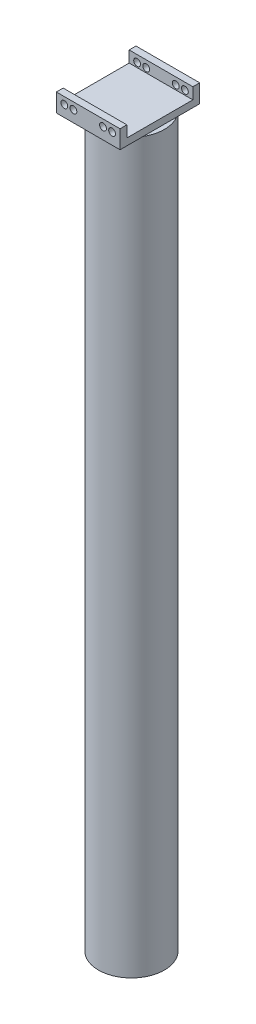
ISO-10303-21;
HEADER;
FILE_DESCRIPTION(('STEP AP214'),'2;1');
FILE_NAME('part.step','',(''),(''),'','','');
FILE_SCHEMA(('AUTOMOTIVE_DESIGN { 1 0 10303 214 1 1 1 1 }'));
ENDSEC;
DATA;
#1=APPLICATION_CONTEXT('core data for automotive mechanical design processes');
#2=APPLICATION_PROTOCOL_DEFINITION('international standard','automotive_design',2000,#1);
#3=PRODUCT_CONTEXT('',#1,'mechanical');
#4=PRODUCT('Part','Part','',(#3));
#5=PRODUCT_RELATED_PRODUCT_CATEGORY('part','',(#4));
#6=PRODUCT_DEFINITION_FORMATION('','',#4);
#7=PRODUCT_DEFINITION_CONTEXT('part definition',#1,'design');
#8=PRODUCT_DEFINITION('design','',#6,#7);
#9=PRODUCT_DEFINITION_SHAPE('','',#8);
#10=(LENGTH_UNIT() NAMED_UNIT(*) SI_UNIT(.MILLI.,.METRE.));
#11=(NAMED_UNIT(*) PLANE_ANGLE_UNIT() SI_UNIT($,.RADIAN.));
#12=(NAMED_UNIT(*) SI_UNIT($,.STERADIAN.) SOLID_ANGLE_UNIT());
#13=UNCERTAINTY_MEASURE_WITH_UNIT(LENGTH_MEASURE(1.E-05),#10,'distance_accuracy_value','');
#14=(GEOMETRIC_REPRESENTATION_CONTEXT(3) GLOBAL_UNCERTAINTY_ASSIGNED_CONTEXT((#13)) GLOBAL_UNIT_ASSIGNED_CONTEXT((#10,
#11,#12)) REPRESENTATION_CONTEXT('',''));
#15=CARTESIAN_POINT('',(0.,0.,0.));
#16=DIRECTION('',(0.,0.,1.));
#17=DIRECTION('',(1.,0.,0.));
#18=AXIS2_PLACEMENT_3D('',#15,#16,#17);
#19=CARTESIAN_POINT('',(-15.5,328.,17.5));
#20=DIRECTION('',(0.,-1.,0.));
#21=DIRECTION('',(0.,0.,-1.));
#22=AXIS2_PLACEMENT_3D('',#19,#20,#21);
#23=PLANE('',#22);
#24=DIRECTION('',(0.,0.,-1.));
#25=VECTOR('',#24,1.);
#26=CARTESIAN_POINT('',(12.5,328.,17.5));
#27=LINE('',#26,#25);
#28=CARTESIAN_POINT('',(12.5,328.,17.5));
#29=VERTEX_POINT('',#28);
#30=CARTESIAN_POINT('',(12.5,328.,14.5));
#31=VERTEX_POINT('',#30);
#32=EDGE_CURVE('E168',#29,#31,#27,.T.);
#33=ORIENTED_EDGE('',*,*,#32,.T.);
#34=DIRECTION('',(1.,0.,0.));
#35=VECTOR('',#34,1.);
#36=CARTESIAN_POINT('',(-44.9278779391243,328.,14.5));
#37=LINE('',#36,#35);
#38=CARTESIAN_POINT('',(-15.5,328.,14.5));
#39=VERTEX_POINT('',#38);
#40=EDGE_CURVE('E122',#39,#31,#37,.T.);
#41=ORIENTED_EDGE('',*,*,#40,.F.);
#42=DIRECTION('',(0.,0.,-1.));
#43=VECTOR('',#42,1.);
#44=CARTESIAN_POINT('',(-15.5,328.,17.5));
#45=LINE('',#44,#43);
#46=CARTESIAN_POINT('',(-15.5,328.,17.5));
#47=VERTEX_POINT('',#46);
#48=EDGE_CURVE('E164',#47,#39,#45,.T.);
#49=ORIENTED_EDGE('',*,*,#48,.F.);
#50=DIRECTION('',(-1.,0.,0.));
#51=VECTOR('',#50,1.);
#52=CARTESIAN_POINT('',(-15.5,328.,17.5));
#53=LINE('',#52,#51);
#54=EDGE_CURVE('E151',#29,#47,#53,.T.);
#55=ORIENTED_EDGE('',*,*,#54,.F.);
#56=EDGE_LOOP('',(#33,#41,#49,#55));
#57=FACE_BOUND('',#56,.T.);
#58=ADVANCED_FACE('F35',(#57),#23,.F.);
#59=CARTESIAN_POINT('',(0.,320.,0.));
#60=DIRECTION('',(0.,-1.,0.));
#61=DIRECTION('',(0.,0.,-1.));
#62=AXIS2_PLACEMENT_3D('',#59,#60,#61);
#63=CYLINDRICAL_SURFACE('',#62,14.5);
#64=CARTESIAN_POINT('',(0.,320.,0.));
#65=DIRECTION('',(0.,1.,0.));
#66=DIRECTION('',(0.,0.,1.));
#67=AXIS2_PLACEMENT_3D('',#64,#65,#66);
#68=CIRCLE('',#67,14.5);
#69=CARTESIAN_POINT('',(12.5,320.,7.34846922834953));
#70=VERTEX_POINT('',#69);
#71=CARTESIAN_POINT('',(12.5,320.,-7.34846922834953));
#72=VERTEX_POINT('',#71);
#73=EDGE_CURVE('E44',#70,#72,#68,.T.);
#74=ORIENTED_EDGE('',*,*,#73,.F.);
#75=EDGE_CURVE('E182',#72,#70,#68,.T.);
#76=ORIENTED_EDGE('',*,*,#75,.F.);
#77=EDGE_LOOP('',(#74,#76));
#78=FACE_BOUND('',#77,.T.);
#79=CARTESIAN_POINT('',(0.,0.,0.));
#80=DIRECTION('',(0.,1.,0.));
#81=DIRECTION('',(0.,0.,1.));
#82=AXIS2_PLACEMENT_3D('',#79,#80,#81);
#83=CIRCLE('',#82,14.5);
#84=CARTESIAN_POINT('',(0.,0.,14.5));
#85=VERTEX_POINT('',#84);
#86=EDGE_CURVE('E180',#85,#85,#83,.T.);
#87=ORIENTED_EDGE('',*,*,#86,.T.);
#88=EDGE_LOOP('',(#87));
#89=FACE_BOUND('',#88,.T.);
#90=ADVANCED_FACE('F37',(#78,#89),#63,.T.);
#91=CARTESIAN_POINT('',(0.,320.,0.));
#92=DIRECTION('',(0.,1.,0.));
#93=DIRECTION('',(0.,0.,1.));
#94=AXIS2_PLACEMENT_3D('',#91,#92,#93);
#95=PLANE('',#94);
#96=DIRECTION('',(0.,0.,-1.));
#97=VECTOR('',#96,1.);
#98=CARTESIAN_POINT('',(12.5,320.,17.5));
#99=LINE('',#98,#97);
#100=EDGE_CURVE('E11',#70,#72,#99,.T.);
#101=ORIENTED_EDGE('',*,*,#100,.F.);
#102=ORIENTED_EDGE('',*,*,#73,.T.);
#103=EDGE_LOOP('',(#101,#102));
#104=FACE_BOUND('',#103,.T.);
#105=ADVANCED_FACE('F227',(#104),#95,.T.);
#106=CARTESIAN_POINT('',(0.,0.,0.));
#107=DIRECTION('',(0.,1.,0.));
#108=DIRECTION('',(0.,0.,1.));
#109=AXIS2_PLACEMENT_3D('',#106,#107,#108);
#110=PLANE('',#109);
#111=CARTESIAN_POINT('',(0.,0.,0.));
#112=DIRECTION('',(0.,1.,0.));
#113=DIRECTION('',(0.,0.,1.));
#114=AXIS2_PLACEMENT_3D('',#111,#112,#113);
#115=CIRCLE('',#114,11.5);
#116=CARTESIAN_POINT('',(0.,0.,11.5));
#117=VERTEX_POINT('',#116);
#118=EDGE_CURVE('E177',#117,#117,#115,.T.);
#119=ORIENTED_EDGE('',*,*,#118,.T.);
#120=EDGE_LOOP('',(#119));
#121=FACE_BOUND('',#120,.T.);
#122=ORIENTED_EDGE('',*,*,#86,.F.);
#123=EDGE_LOOP('',(#122));
#124=FACE_BOUND('',#123,.T.);
#125=ADVANCED_FACE('F229',(#121,#124),#110,.F.);
#126=CARTESIAN_POINT('',(0.,320.,0.));
#127=DIRECTION('',(0.,-1.,0.));
#128=DIRECTION('',(0.,0.,-1.));
#129=AXIS2_PLACEMENT_3D('',#126,#127,#128);
#130=CYLINDRICAL_SURFACE('',#129,11.5);
#131=CARTESIAN_POINT('',(0.,320.,0.));
#132=DIRECTION('',(0.,1.,0.));
#133=DIRECTION('',(0.,0.,1.));
#134=AXIS2_PLACEMENT_3D('',#131,#132,#133);
#135=CIRCLE('',#134,11.5);
#136=CARTESIAN_POINT('',(0.,320.,11.5));
#137=VERTEX_POINT('',#136);
#138=EDGE_CURVE('E174',#137,#137,#135,.T.);
#139=ORIENTED_EDGE('',*,*,#138,.T.);
#140=EDGE_LOOP('',(#139));
#141=FACE_BOUND('',#140,.T.);
#142=ORIENTED_EDGE('',*,*,#118,.F.);
#143=EDGE_LOOP('',(#142));
#144=FACE_BOUND('',#143,.T.);
#145=ADVANCED_FACE('F235',(#141,#144),#130,.F.);
#146=CARTESIAN_POINT('',(0.,0.,-17.5));
#147=DIRECTION('',(0.,0.,1.));
#148=DIRECTION('',(1.,0.,0.));
#149=AXIS2_PLACEMENT_3D('',#146,#147,#148);
#150=PLANE('',#149);
#151=CARTESIAN_POINT('',(-12.,325.,-17.5));
#152=DIRECTION('',(0.,0.,1.));
#153=DIRECTION('',(1.,0.,0.));
#154=AXIS2_PLACEMENT_3D('',#151,#152,#153);
#155=CIRCLE('',#154,1.5);
#156=CARTESIAN_POINT('',(-10.5,325.,-17.5));
#157=VERTEX_POINT('',#156);
#158=EDGE_CURVE('E285',#157,#157,#155,.F.);
#159=ORIENTED_EDGE('',*,*,#158,.F.);
#160=EDGE_LOOP('',(#159));
#161=FACE_BOUND('',#160,.T.);
#162=CARTESIAN_POINT('',(9.,325.,-17.5));
#163=DIRECTION('',(0.,0.,1.));
#164=DIRECTION('',(1.,0.,0.));
#165=AXIS2_PLACEMENT_3D('',#162,#163,#164);
#166=CIRCLE('',#165,1.5);
#167=CARTESIAN_POINT('',(10.5,325.,-17.5));
#168=VERTEX_POINT('',#167);
#169=EDGE_CURVE('E289',#168,#168,#166,.F.);
#170=ORIENTED_EDGE('',*,*,#169,.F.);
#171=EDGE_LOOP('',(#170));
#172=FACE_BOUND('',#171,.T.);
#173=CARTESIAN_POINT('',(5.,325.,-17.5));
#174=DIRECTION('',(0.,0.,1.));
#175=DIRECTION('',(1.,0.,0.));
#176=AXIS2_PLACEMENT_3D('',#173,#174,#175);
#177=CIRCLE('',#176,1.5);
#178=CARTESIAN_POINT('',(6.5,325.,-17.5));
#179=VERTEX_POINT('',#178);
#180=EDGE_CURVE('E293',#179,#179,#177,.F.);
#181=ORIENTED_EDGE('',*,*,#180,.F.);
#182=EDGE_LOOP('',(#181));
#183=FACE_BOUND('',#182,.T.);
#184=CARTESIAN_POINT('',(-8.,325.,-17.5));
#185=DIRECTION('',(0.,0.,1.));
#186=DIRECTION('',(1.,0.,0.));
#187=AXIS2_PLACEMENT_3D('',#184,#185,#186);
#188=CIRCLE('',#187,1.5);
#189=CARTESIAN_POINT('',(-6.5,325.,-17.5));
#190=VERTEX_POINT('',#189);
#191=EDGE_CURVE('E189',#190,#190,#188,.F.);
#192=ORIENTED_EDGE('',*,*,#191,.F.);
#193=EDGE_LOOP('',(#192));
#194=FACE_BOUND('',#193,.T.);
#195=DIRECTION('',(0.,-1.,0.));
#196=VECTOR('',#195,1.);
#197=CARTESIAN_POINT('',(-15.5,328.,-17.5));
#198=LINE('',#197,#196);
#199=CARTESIAN_POINT('',(-15.5,328.,-17.5));
#200=VERTEX_POINT('',#199);
#201=CARTESIAN_POINT('',(-15.5,320.,-17.5));
#202=VERTEX_POINT('',#201);
#203=EDGE_CURVE('E141',#200,#202,#198,.T.);
#204=ORIENTED_EDGE('',*,*,#203,.F.);
#205=DIRECTION('',(-1.,0.,0.));
#206=VECTOR('',#205,1.);
#207=CARTESIAN_POINT('',(-15.5,328.,-17.5));
#208=LINE('',#207,#206);
#209=CARTESIAN_POINT('',(12.5,328.,-17.5));
#210=VERTEX_POINT('',#209);
#211=EDGE_CURVE('E147',#210,#200,#208,.T.);
#212=ORIENTED_EDGE('',*,*,#211,.F.);
#213=DIRECTION('',(0.,1.,0.));
#214=VECTOR('',#213,1.);
#215=CARTESIAN_POINT('',(12.5,328.,-17.5));
#216=LINE('',#215,#214);
#217=CARTESIAN_POINT('',(12.5,320.,-17.5));
#218=VERTEX_POINT('',#217);
#219=EDGE_CURVE('E159',#218,#210,#216,.T.);
#220=ORIENTED_EDGE('',*,*,#219,.F.);
#221=DIRECTION('',(1.,0.,0.));
#222=VECTOR('',#221,1.);
#223=CARTESIAN_POINT('',(-15.5,320.,-17.5));
#224=LINE('',#223,#222);
#225=EDGE_CURVE('E156',#202,#218,#224,.T.);
#226=ORIENTED_EDGE('',*,*,#225,.F.);
#227=EDGE_LOOP('',(#204,#212,#220,#226));
#228=FACE_BOUND('',#227,.T.);
#229=ADVANCED_FACE('F251',(#161,#172,#183,#194,#228),#150,.F.);
#230=CARTESIAN_POINT('',(0.,0.,17.5));
#231=DIRECTION('',(0.,0.,1.));
#232=DIRECTION('',(1.,0.,0.));
#233=AXIS2_PLACEMENT_3D('',#230,#231,#232);
#234=PLANE('',#233);
#235=CARTESIAN_POINT('',(-12.,325.,17.5));
#236=DIRECTION('',(0.,0.,1.));
#237=DIRECTION('',(1.,0.,0.));
#238=AXIS2_PLACEMENT_3D('',#235,#236,#237);
#239=CIRCLE('',#238,1.5);
#240=CARTESIAN_POINT('',(-10.5,325.,17.5));
#241=VERTEX_POINT('',#240);
#242=EDGE_CURVE('E305',#241,#241,#239,.T.);
#243=ORIENTED_EDGE('',*,*,#242,.F.);
#244=EDGE_LOOP('',(#243));
#245=FACE_BOUND('',#244,.T.);
#246=CARTESIAN_POINT('',(9.,325.,17.5));
#247=DIRECTION('',(0.,0.,1.));
#248=DIRECTION('',(1.,0.,0.));
#249=AXIS2_PLACEMENT_3D('',#246,#247,#248);
#250=CIRCLE('',#249,1.5);
#251=CARTESIAN_POINT('',(10.5,325.,17.5));
#252=VERTEX_POINT('',#251);
#253=EDGE_CURVE('E304',#252,#252,#250,.T.);
#254=ORIENTED_EDGE('',*,*,#253,.F.);
#255=EDGE_LOOP('',(#254));
#256=FACE_BOUND('',#255,.T.);
#257=CARTESIAN_POINT('',(5.,325.,17.5));
#258=DIRECTION('',(0.,0.,1.));
#259=DIRECTION('',(1.,0.,0.));
#260=AXIS2_PLACEMENT_3D('',#257,#258,#259);
#261=CIRCLE('',#260,1.5);
#262=CARTESIAN_POINT('',(6.5,325.,17.5));
#263=VERTEX_POINT('',#262);
#264=EDGE_CURVE('E309',#263,#263,#261,.T.);
#265=ORIENTED_EDGE('',*,*,#264,.F.);
#266=EDGE_LOOP('',(#265));
#267=FACE_BOUND('',#266,.T.);
#268=CARTESIAN_POINT('',(-8.,325.,17.5));
#269=DIRECTION('',(0.,0.,1.));
#270=DIRECTION('',(1.,0.,0.));
#271=AXIS2_PLACEMENT_3D('',#268,#269,#270);
#272=CIRCLE('',#271,1.5);
#273=CARTESIAN_POINT('',(-6.5,325.,17.5));
#274=VERTEX_POINT('',#273);
#275=EDGE_CURVE('E299',#274,#274,#272,.T.);
#276=ORIENTED_EDGE('',*,*,#275,.F.);
#277=EDGE_LOOP('',(#276));
#278=FACE_BOUND('',#277,.T.);
#279=DIRECTION('',(0.,-1.,0.));
#280=VECTOR('',#279,1.);
#281=CARTESIAN_POINT('',(-15.5,328.,17.5));
#282=LINE('',#281,#280);
#283=CARTESIAN_POINT('',(-15.5,320.,17.5));
#284=VERTEX_POINT('',#283);
#285=EDGE_CURVE('E143',#47,#284,#282,.T.);
#286=ORIENTED_EDGE('',*,*,#285,.T.);
#287=DIRECTION('',(1.,0.,0.));
#288=VECTOR('',#287,1.);
#289=CARTESIAN_POINT('',(-15.5,320.,17.5));
#290=LINE('',#289,#288);
#291=CARTESIAN_POINT('',(12.5,320.,17.5));
#292=VERTEX_POINT('',#291);
#293=EDGE_CURVE('E146',#284,#292,#290,.T.);
#294=ORIENTED_EDGE('',*,*,#293,.T.);
#295=DIRECTION('',(0.,1.,0.));
#296=VECTOR('',#295,1.);
#297=CARTESIAN_POINT('',(12.5,328.,17.5));
#298=LINE('',#297,#296);
#299=EDGE_CURVE('E149',#292,#29,#298,.T.);
#300=ORIENTED_EDGE('',*,*,#299,.T.);
#301=ORIENTED_EDGE('',*,*,#54,.T.);
#302=EDGE_LOOP('',(#286,#294,#300,#301));
#303=FACE_BOUND('',#302,.T.);
#304=ADVANCED_FACE('F217',(#245,#256,#267,#278,#303),#234,.T.);
#305=CARTESIAN_POINT('',(-15.5,328.,-14.5));
#306=VERTEX_POINT('',#305);
#307=EDGE_CURVE('E153',#306,#200,#45,.T.);
#308=ORIENTED_EDGE('',*,*,#307,.F.);
#309=DIRECTION('',(1.,0.,0.));
#310=VECTOR('',#309,1.);
#311=CARTESIAN_POINT('',(-44.9278779391243,328.,-14.5));
#312=LINE('',#311,#310);
#313=CARTESIAN_POINT('',(12.5,328.,-14.5));
#314=VERTEX_POINT('',#313);
#315=EDGE_CURVE('E136',#306,#314,#312,.T.);
#316=ORIENTED_EDGE('',*,*,#315,.T.);
#317=EDGE_CURVE('E167',#314,#210,#27,.T.);
#318=ORIENTED_EDGE('',*,*,#317,.T.);
#319=ORIENTED_EDGE('',*,*,#211,.T.);
#320=EDGE_LOOP('',(#308,#316,#318,#319));
#321=FACE_BOUND('',#320,.T.);
#322=ADVANCED_FACE('F240',(#321),#23,.F.);
#323=CARTESIAN_POINT('',(12.5,328.,17.5));
#324=DIRECTION('',(-1.,0.,0.));
#325=DIRECTION('',(0.,-1.,0.));
#326=AXIS2_PLACEMENT_3D('',#323,#324,#325);
#327=PLANE('',#326);
#328=DIRECTION('',(0.,0.,-1.));
#329=VECTOR('',#328,1.);
#330=CARTESIAN_POINT('',(12.5,323.,14.5));
#331=LINE('',#330,#329);
#332=CARTESIAN_POINT('',(12.5,323.,14.5));
#333=VERTEX_POINT('',#332);
#334=CARTESIAN_POINT('',(12.5,323.,-14.5));
#335=VERTEX_POINT('',#334);
#336=EDGE_CURVE('E110',#333,#335,#331,.T.);
#337=ORIENTED_EDGE('',*,*,#336,.F.);
#338=DIRECTION('',(0.,-1.,0.));
#339=VECTOR('',#338,1.);
#340=CARTESIAN_POINT('',(12.5,328.,14.5));
#341=LINE('',#340,#339);
#342=EDGE_CURVE('E119',#31,#333,#341,.T.);
#343=ORIENTED_EDGE('',*,*,#342,.F.);
#344=ORIENTED_EDGE('',*,*,#32,.F.);
#345=ORIENTED_EDGE('',*,*,#299,.F.);
#346=EDGE_CURVE('E46',#292,#70,#99,.T.);
#347=ORIENTED_EDGE('',*,*,#346,.T.);
#348=ORIENTED_EDGE('',*,*,#100,.T.);
#349=EDGE_CURVE('E47',#72,#218,#99,.T.);
#350=ORIENTED_EDGE('',*,*,#349,.T.);
#351=ORIENTED_EDGE('',*,*,#219,.T.);
#352=ORIENTED_EDGE('',*,*,#317,.F.);
#353=DIRECTION('',(0.,1.,0.));
#354=VECTOR('',#353,1.);
#355=CARTESIAN_POINT('',(12.5,328.,-14.5));
#356=LINE('',#355,#354);
#357=EDGE_CURVE('E116',#335,#314,#356,.T.);
#358=ORIENTED_EDGE('',*,*,#357,.F.);
#359=EDGE_LOOP('',(#337,#343,#344,#345,#347,#348,#350,#351,#352,#358));
#360=FACE_BOUND('',#359,.T.);
#361=ADVANCED_FACE('F128',(#360),#327,.F.);
#362=CARTESIAN_POINT('',(-15.5,328.,17.5));
#363=DIRECTION('',(1.,0.,0.));
#364=DIRECTION('',(0.,0.,-1.));
#365=AXIS2_PLACEMENT_3D('',#362,#363,#364);
#366=PLANE('',#365);
#367=ORIENTED_EDGE('',*,*,#48,.T.);
#368=DIRECTION('',(0.,1.,0.));
#369=VECTOR('',#368,1.);
#370=CARTESIAN_POINT('',(-15.5,328.,14.5));
#371=LINE('',#370,#369);
#372=CARTESIAN_POINT('',(-15.5,323.,14.5));
#373=VERTEX_POINT('',#372);
#374=EDGE_CURVE('E142',#373,#39,#371,.T.);
#375=ORIENTED_EDGE('',*,*,#374,.F.);
#376=DIRECTION('',(0.,0.,1.));
#377=VECTOR('',#376,1.);
#378=CARTESIAN_POINT('',(-15.5,323.,14.5));
#379=LINE('',#378,#377);
#380=CARTESIAN_POINT('',(-15.5,323.,-14.5));
#381=VERTEX_POINT('',#380);
#382=EDGE_CURVE('E113',#381,#373,#379,.T.);
#383=ORIENTED_EDGE('',*,*,#382,.F.);
#384=DIRECTION('',(0.,-1.,0.));
#385=VECTOR('',#384,1.);
#386=CARTESIAN_POINT('',(-15.5,328.,-14.5));
#387=LINE('',#386,#385);
#388=EDGE_CURVE('E135',#306,#381,#387,.T.);
#389=ORIENTED_EDGE('',*,*,#388,.F.);
#390=ORIENTED_EDGE('',*,*,#307,.T.);
#391=ORIENTED_EDGE('',*,*,#203,.T.);
#392=DIRECTION('',(0.,0.,-1.));
#393=VECTOR('',#392,1.);
#394=CARTESIAN_POINT('',(-15.5,320.,17.5));
#395=LINE('',#394,#393);
#396=EDGE_CURVE('E171',#284,#202,#395,.T.);
#397=ORIENTED_EDGE('',*,*,#396,.F.);
#398=ORIENTED_EDGE('',*,*,#285,.F.);
#399=EDGE_LOOP('',(#367,#375,#383,#389,#390,#391,#397,#398));
#400=FACE_BOUND('',#399,.T.);
#401=ADVANCED_FACE('F214',(#400),#366,.F.);
#402=CARTESIAN_POINT('',(-15.5,320.,17.5));
#403=DIRECTION('',(0.,1.,0.));
#404=DIRECTION('',(0.,0.,1.));
#405=AXIS2_PLACEMENT_3D('',#402,#403,#404);
#406=PLANE('',#405);
#407=ORIENTED_EDGE('',*,*,#349,.F.);
#408=ORIENTED_EDGE('',*,*,#75,.T.);
#409=ORIENTED_EDGE('',*,*,#346,.F.);
#410=ORIENTED_EDGE('',*,*,#293,.F.);
#411=ORIENTED_EDGE('',*,*,#396,.T.);
#412=ORIENTED_EDGE('',*,*,#225,.T.);
#413=EDGE_LOOP('',(#407,#408,#409,#410,#411,#412));
#414=FACE_BOUND('',#413,.T.);
#415=ADVANCED_FACE('F223',(#414),#406,.F.);
#416=ORIENTED_EDGE('',*,*,#138,.F.);
#417=EDGE_LOOP('',(#416));
#418=FACE_BOUND('',#417,.T.);
#419=ADVANCED_FACE('F269',(#418),#406,.F.);
#420=CARTESIAN_POINT('',(-44.9278779391243,328.,14.5));
#421=DIRECTION('',(0.,0.,1.));
#422=DIRECTION('',(1.,0.,0.));
#423=AXIS2_PLACEMENT_3D('',#420,#421,#422);
#424=PLANE('',#423);
#425=CARTESIAN_POINT('',(-12.,325.,14.5));
#426=DIRECTION('',(0.,0.,1.));
#427=DIRECTION('',(1.,0.,0.));
#428=AXIS2_PLACEMENT_3D('',#425,#426,#427);
#429=CIRCLE('',#428,1.5);
#430=CARTESIAN_POINT('',(-10.5,325.,14.5));
#431=VERTEX_POINT('',#430);
#432=EDGE_CURVE('E126',#431,#431,#429,.T.);
#433=ORIENTED_EDGE('',*,*,#432,.T.);
#434=EDGE_LOOP('',(#433));
#435=FACE_BOUND('',#434,.T.);
#436=CARTESIAN_POINT('',(9.,325.,14.5));
#437=DIRECTION('',(0.,0.,1.));
#438=DIRECTION('',(1.,0.,0.));
#439=AXIS2_PLACEMENT_3D('',#436,#437,#438);
#440=CIRCLE('',#439,1.5);
#441=CARTESIAN_POINT('',(10.5,325.,14.5));
#442=VERTEX_POINT('',#441);
#443=EDGE_CURVE('E195',#442,#442,#440,.T.);
#444=ORIENTED_EDGE('',*,*,#443,.T.);
#445=EDGE_LOOP('',(#444));
#446=FACE_BOUND('',#445,.T.);
#447=CARTESIAN_POINT('',(5.,325.,14.5));
#448=DIRECTION('',(0.,0.,1.));
#449=DIRECTION('',(1.,0.,0.));
#450=AXIS2_PLACEMENT_3D('',#447,#448,#449);
#451=CIRCLE('',#450,1.5);
#452=CARTESIAN_POINT('',(6.5,325.,14.5));
#453=VERTEX_POINT('',#452);
#454=EDGE_CURVE('E192',#453,#453,#451,.T.);
#455=ORIENTED_EDGE('',*,*,#454,.T.);
#456=EDGE_LOOP('',(#455));
#457=FACE_BOUND('',#456,.T.);
#458=CARTESIAN_POINT('',(-8.,325.,14.5));
#459=DIRECTION('',(0.,0.,1.));
#460=DIRECTION('',(1.,0.,0.));
#461=AXIS2_PLACEMENT_3D('',#458,#459,#460);
#462=CIRCLE('',#461,1.5);
#463=CARTESIAN_POINT('',(-6.5,325.,14.5));
#464=VERTEX_POINT('',#463);
#465=EDGE_CURVE('E188',#464,#464,#462,.T.);
#466=ORIENTED_EDGE('',*,*,#465,.T.);
#467=EDGE_LOOP('',(#466));
#468=FACE_BOUND('',#467,.T.);
#469=ORIENTED_EDGE('',*,*,#374,.T.);
#470=ORIENTED_EDGE('',*,*,#40,.T.);
#471=ORIENTED_EDGE('',*,*,#342,.T.);
#472=DIRECTION('',(1.,0.,0.));
#473=VECTOR('',#472,1.);
#474=CARTESIAN_POINT('',(-44.9278779391243,323.,14.5));
#475=LINE('',#474,#473);
#476=EDGE_CURVE('E106',#373,#333,#475,.T.);
#477=ORIENTED_EDGE('',*,*,#476,.F.);
#478=EDGE_LOOP('',(#469,#470,#471,#477));
#479=FACE_BOUND('',#478,.T.);
#480=ADVANCED_FACE('F120',(#435,#446,#457,#468,#479),#424,.F.);
#481=CARTESIAN_POINT('',(-44.9278779391243,328.,-14.5));
#482=DIRECTION('',(0.,0.,-1.));
#483=DIRECTION('',(-1.,0.,0.));
#484=AXIS2_PLACEMENT_3D('',#481,#482,#483);
#485=PLANE('',#484);
#486=CARTESIAN_POINT('',(-12.,325.,-14.5));
#487=DIRECTION('',(0.,0.,-1.));
#488=DIRECTION('',(-1.,0.,0.));
#489=AXIS2_PLACEMENT_3D('',#486,#487,#488);
#490=CIRCLE('',#489,1.5);
#491=CARTESIAN_POINT('',(-13.5,325.,-14.5));
#492=VERTEX_POINT('',#491);
#493=EDGE_CURVE('E39',#492,#492,#490,.T.);
#494=ORIENTED_EDGE('',*,*,#493,.T.);
#495=EDGE_LOOP('',(#494));
#496=FACE_BOUND('',#495,.T.);
#497=CARTESIAN_POINT('',(9.,325.,-14.5));
#498=DIRECTION('',(0.,0.,-1.));
#499=DIRECTION('',(-1.,0.,0.));
#500=AXIS2_PLACEMENT_3D('',#497,#498,#499);
#501=CIRCLE('',#500,1.5);
#502=CARTESIAN_POINT('',(7.5,325.,-14.5));
#503=VERTEX_POINT('',#502);
#504=EDGE_CURVE('E193',#503,#503,#501,.T.);
#505=ORIENTED_EDGE('',*,*,#504,.T.);
#506=EDGE_LOOP('',(#505));
#507=FACE_BOUND('',#506,.T.);
#508=CARTESIAN_POINT('',(5.,325.,-14.5));
#509=DIRECTION('',(0.,0.,-1.));
#510=DIRECTION('',(-1.,0.,0.));
#511=AXIS2_PLACEMENT_3D('',#508,#509,#510);
#512=CIRCLE('',#511,1.5);
#513=CARTESIAN_POINT('',(3.5,325.,-14.5));
#514=VERTEX_POINT('',#513);
#515=EDGE_CURVE('E190',#514,#514,#512,.T.);
#516=ORIENTED_EDGE('',*,*,#515,.T.);
#517=EDGE_LOOP('',(#516));
#518=FACE_BOUND('',#517,.T.);
#519=CARTESIAN_POINT('',(-8.,325.,-14.5));
#520=DIRECTION('',(0.,0.,-1.));
#521=DIRECTION('',(-1.,0.,0.));
#522=AXIS2_PLACEMENT_3D('',#519,#520,#521);
#523=CIRCLE('',#522,1.5);
#524=CARTESIAN_POINT('',(-9.5,325.,-14.5));
#525=VERTEX_POINT('',#524);
#526=EDGE_CURVE('E185',#525,#525,#523,.T.);
#527=ORIENTED_EDGE('',*,*,#526,.T.);
#528=EDGE_LOOP('',(#527));
#529=FACE_BOUND('',#528,.T.);
#530=ORIENTED_EDGE('',*,*,#388,.T.);
#531=DIRECTION('',(1.,0.,0.));
#532=VECTOR('',#531,1.);
#533=CARTESIAN_POINT('',(-44.9278779391243,323.,-14.5));
#534=LINE('',#533,#532);
#535=EDGE_CURVE('E54',#381,#335,#534,.T.);
#536=ORIENTED_EDGE('',*,*,#535,.T.);
#537=ORIENTED_EDGE('',*,*,#357,.T.);
#538=ORIENTED_EDGE('',*,*,#315,.F.);
#539=EDGE_LOOP('',(#530,#536,#537,#538));
#540=FACE_BOUND('',#539,.T.);
#541=ADVANCED_FACE('F259',(#496,#507,#518,#529,#540),#485,.F.);
#542=CARTESIAN_POINT('',(-44.9278779391243,323.,14.5));
#543=DIRECTION('',(0.,-1.,0.));
#544=DIRECTION('',(1.,0.,0.));
#545=AXIS2_PLACEMENT_3D('',#542,#543,#544);
#546=PLANE('',#545);
#547=ORIENTED_EDGE('',*,*,#382,.T.);
#548=ORIENTED_EDGE('',*,*,#476,.T.);
#549=ORIENTED_EDGE('',*,*,#336,.T.);
#550=ORIENTED_EDGE('',*,*,#535,.F.);
#551=EDGE_LOOP('',(#547,#548,#549,#550));
#552=FACE_BOUND('',#551,.T.);
#553=ADVANCED_FACE('F108',(#552),#546,.F.);
#554=CARTESIAN_POINT('',(-8.,325.,-21.7426406871193));
#555=DIRECTION('',(0.,0.,1.));
#556=DIRECTION('',(1.,0.,0.));
#557=AXIS2_PLACEMENT_3D('',#554,#555,#556);
#558=CYLINDRICAL_SURFACE('',#557,1.5);
#559=ORIENTED_EDGE('',*,*,#191,.T.);
#560=EDGE_LOOP('',(#559));
#561=FACE_BOUND('',#560,.T.);
#562=ORIENTED_EDGE('',*,*,#526,.F.);
#563=EDGE_LOOP('',(#562));
#564=FACE_BOUND('',#563,.T.);
#565=ADVANCED_FACE('F267',(#561,#564),#558,.F.);
#566=CARTESIAN_POINT('',(5.,325.,-21.7426406871193));
#567=DIRECTION('',(0.,0.,1.));
#568=DIRECTION('',(1.,0.,0.));
#569=AXIS2_PLACEMENT_3D('',#566,#567,#568);
#570=CYLINDRICAL_SURFACE('',#569,1.5);
#571=ORIENTED_EDGE('',*,*,#180,.T.);
#572=EDGE_LOOP('',(#571));
#573=FACE_BOUND('',#572,.T.);
#574=ORIENTED_EDGE('',*,*,#515,.F.);
#575=EDGE_LOOP('',(#574));
#576=FACE_BOUND('',#575,.T.);
#577=ADVANCED_FACE('F334',(#573,#576),#570,.F.);
#578=CARTESIAN_POINT('',(9.,325.,-21.7426406871193));
#579=DIRECTION('',(0.,0.,1.));
#580=DIRECTION('',(1.,0.,0.));
#581=AXIS2_PLACEMENT_3D('',#578,#579,#580);
#582=CYLINDRICAL_SURFACE('',#581,1.5);
#583=ORIENTED_EDGE('',*,*,#169,.T.);
#584=EDGE_LOOP('',(#583));
#585=FACE_BOUND('',#584,.T.);
#586=ORIENTED_EDGE('',*,*,#504,.F.);
#587=EDGE_LOOP('',(#586));
#588=FACE_BOUND('',#587,.T.);
#589=ADVANCED_FACE('F335',(#585,#588),#582,.F.);
#590=CARTESIAN_POINT('',(-12.,325.,-21.7426406871193));
#591=DIRECTION('',(0.,0.,1.));
#592=DIRECTION('',(1.,0.,0.));
#593=AXIS2_PLACEMENT_3D('',#590,#591,#592);
#594=CYLINDRICAL_SURFACE('',#593,1.5);
#595=ORIENTED_EDGE('',*,*,#158,.T.);
#596=EDGE_LOOP('',(#595));
#597=FACE_BOUND('',#596,.T.);
#598=ORIENTED_EDGE('',*,*,#493,.F.);
#599=EDGE_LOOP('',(#598));
#600=FACE_BOUND('',#599,.T.);
#601=ADVANCED_FACE('F324',(#597,#600),#594,.F.);
#602=ORIENTED_EDGE('',*,*,#275,.T.);
#603=EDGE_LOOP('',(#602));
#604=FACE_BOUND('',#603,.T.);
#605=ORIENTED_EDGE('',*,*,#465,.F.);
#606=EDGE_LOOP('',(#605));
#607=FACE_BOUND('',#606,.T.);
#608=ADVANCED_FACE('F274',(#604,#607),#558,.F.);
#609=ORIENTED_EDGE('',*,*,#264,.T.);
#610=EDGE_LOOP('',(#609));
#611=FACE_BOUND('',#610,.T.);
#612=ORIENTED_EDGE('',*,*,#454,.F.);
#613=EDGE_LOOP('',(#612));
#614=FACE_BOUND('',#613,.T.);
#615=ADVANCED_FACE('F316',(#611,#614),#570,.F.);
#616=ORIENTED_EDGE('',*,*,#253,.T.);
#617=EDGE_LOOP('',(#616));
#618=FACE_BOUND('',#617,.T.);
#619=ORIENTED_EDGE('',*,*,#443,.F.);
#620=EDGE_LOOP('',(#619));
#621=FACE_BOUND('',#620,.T.);
#622=ADVANCED_FACE('F332',(#618,#621),#582,.F.);
#623=ORIENTED_EDGE('',*,*,#242,.T.);
#624=EDGE_LOOP('',(#623));
#625=FACE_BOUND('',#624,.T.);
#626=ORIENTED_EDGE('',*,*,#432,.F.);
#627=EDGE_LOOP('',(#626));
#628=FACE_BOUND('',#627,.T.);
#629=ADVANCED_FACE('F337',(#625,#628),#594,.F.);
#630=CLOSED_SHELL('',(#58,#90,#105,#125,#145,#229,#304,#322,#361,#401,#415,#419,#480,#541,#553,
#565,#577,#589,#601,#608,#615,#622,#629));
#631=MANIFOLD_SOLID_BREP('B2',#630);
#632=ADVANCED_BREP_SHAPE_REPRESENTATION('',(#18,#631),#14);
#633=SHAPE_DEFINITION_REPRESENTATION(#9,#632);
ENDSEC;
END-ISO-10303-21;
